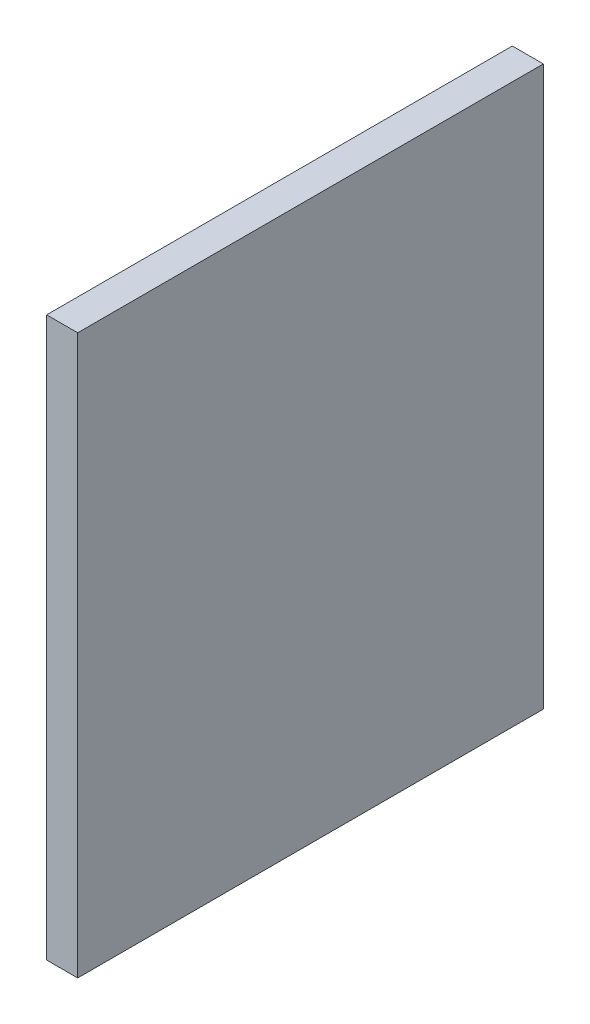
ISO-10303-21;
HEADER;
FILE_DESCRIPTION(('STEP AP214'),'2;1');
FILE_NAME('part.step','',(''),(''),'','','');
FILE_SCHEMA(('AUTOMOTIVE_DESIGN { 1 0 10303 214 1 1 1 1 }'));
ENDSEC;
DATA;
#1=APPLICATION_CONTEXT('core data for automotive mechanical design processes');
#2=APPLICATION_PROTOCOL_DEFINITION('international standard','automotive_design',2000,#1);
#3=PRODUCT_CONTEXT('',#1,'mechanical');
#4=PRODUCT('Part','Part','',(#3));
#5=PRODUCT_RELATED_PRODUCT_CATEGORY('part','',(#4));
#6=PRODUCT_DEFINITION_FORMATION('','',#4);
#7=PRODUCT_DEFINITION_CONTEXT('part definition',#1,'design');
#8=PRODUCT_DEFINITION('design','',#6,#7);
#9=PRODUCT_DEFINITION_SHAPE('','',#8);
#10=(LENGTH_UNIT() NAMED_UNIT(*) SI_UNIT(.MILLI.,.METRE.));
#11=(NAMED_UNIT(*) PLANE_ANGLE_UNIT() SI_UNIT($,.RADIAN.));
#12=(NAMED_UNIT(*) SI_UNIT($,.STERADIAN.) SOLID_ANGLE_UNIT());
#13=UNCERTAINTY_MEASURE_WITH_UNIT(LENGTH_MEASURE(1.E-05),#10,'distance_accuracy_value','');
#14=(GEOMETRIC_REPRESENTATION_CONTEXT(3) GLOBAL_UNCERTAINTY_ASSIGNED_CONTEXT((#13)) GLOBAL_UNIT_ASSIGNED_CONTEXT((#10,
#11,#12)) REPRESENTATION_CONTEXT('',''));
#15=CARTESIAN_POINT('',(0.,0.,0.));
#16=DIRECTION('',(0.,0.,1.));
#17=DIRECTION('',(1.,0.,0.));
#18=AXIS2_PLACEMENT_3D('',#15,#16,#17);
#19=CARTESIAN_POINT('',(2.,-18.,15.));
#20=DIRECTION('',(0.,0.,-1.));
#21=DIRECTION('',(-1.,0.,0.));
#22=AXIS2_PLACEMENT_3D('',#19,#20,#21);
#23=PLANE('',#22);
#24=DIRECTION('',(0.,-1.,0.));
#25=VECTOR('',#24,1.);
#26=CARTESIAN_POINT('',(0.,-18.,15.));
#27=LINE('',#26,#25);
#28=CARTESIAN_POINT('',(0.,18.,15.));
#29=VERTEX_POINT('',#28);
#30=CARTESIAN_POINT('',(0.,-18.,15.));
#31=VERTEX_POINT('',#30);
#32=EDGE_CURVE('E95',#29,#31,#27,.T.);
#33=ORIENTED_EDGE('',*,*,#32,.T.);
#34=DIRECTION('',(-1.,0.,0.));
#35=VECTOR('',#34,1.);
#36=CARTESIAN_POINT('',(2.,-18.,15.));
#37=LINE('',#36,#35);
#38=CARTESIAN_POINT('',(2.,-18.,15.));
#39=VERTEX_POINT('',#38);
#40=EDGE_CURVE('E11',#39,#31,#37,.T.);
#41=ORIENTED_EDGE('',*,*,#40,.F.);
#42=DIRECTION('',(0.,-1.,0.));
#43=VECTOR('',#42,1.);
#44=CARTESIAN_POINT('',(2.,-18.,15.));
#45=LINE('',#44,#43);
#46=CARTESIAN_POINT('',(2.,18.,15.));
#47=VERTEX_POINT('',#46);
#48=EDGE_CURVE('E83',#47,#39,#45,.T.);
#49=ORIENTED_EDGE('',*,*,#48,.F.);
#50=DIRECTION('',(-1.,0.,0.));
#51=VECTOR('',#50,1.);
#52=CARTESIAN_POINT('',(2.,18.,15.));
#53=LINE('',#52,#51);
#54=EDGE_CURVE('E91',#47,#29,#53,.T.);
#55=ORIENTED_EDGE('',*,*,#54,.T.);
#56=EDGE_LOOP('',(#33,#41,#49,#55));
#57=FACE_BOUND('',#56,.T.);
#58=ADVANCED_FACE('F32',(#57),#23,.F.);
#59=CARTESIAN_POINT('',(2.,-18.,-15.));
#60=DIRECTION('',(0.,1.,0.));
#61=DIRECTION('',(0.,0.,1.));
#62=AXIS2_PLACEMENT_3D('',#59,#60,#61);
#63=PLANE('',#62);
#64=DIRECTION('',(0.,0.,-1.));
#65=VECTOR('',#64,1.);
#66=CARTESIAN_POINT('',(0.,-18.,-15.));
#67=LINE('',#66,#65);
#68=CARTESIAN_POINT('',(0.,-18.,-15.));
#69=VERTEX_POINT('',#68);
#70=EDGE_CURVE('E87',#31,#69,#67,.T.);
#71=ORIENTED_EDGE('',*,*,#70,.T.);
#72=DIRECTION('',(-1.,0.,0.));
#73=VECTOR('',#72,1.);
#74=CARTESIAN_POINT('',(2.,-18.,-15.));
#75=LINE('',#74,#73);
#76=CARTESIAN_POINT('',(2.,-18.,-15.));
#77=VERTEX_POINT('',#76);
#78=EDGE_CURVE('E40',#77,#69,#75,.T.);
#79=ORIENTED_EDGE('',*,*,#78,.F.);
#80=DIRECTION('',(0.,0.,-1.));
#81=VECTOR('',#80,1.);
#82=CARTESIAN_POINT('',(2.,-18.,-15.));
#83=LINE('',#82,#81);
#84=EDGE_CURVE('E78',#39,#77,#83,.T.);
#85=ORIENTED_EDGE('',*,*,#84,.F.);
#86=ORIENTED_EDGE('',*,*,#40,.T.);
#87=EDGE_LOOP('',(#71,#79,#85,#86));
#88=FACE_BOUND('',#87,.T.);
#89=ADVANCED_FACE('F86',(#88),#63,.F.);
#90=CARTESIAN_POINT('',(2.,-18.,-15.));
#91=DIRECTION('',(0.,0.,1.));
#92=DIRECTION('',(1.,0.,0.));
#93=AXIS2_PLACEMENT_3D('',#90,#91,#92);
#94=PLANE('',#93);
#95=DIRECTION('',(0.,1.,0.));
#96=VECTOR('',#95,1.);
#97=CARTESIAN_POINT('',(0.,-18.,-15.));
#98=LINE('',#97,#96);
#99=CARTESIAN_POINT('',(0.,18.,-15.));
#100=VERTEX_POINT('',#99);
#101=EDGE_CURVE('E65',#69,#100,#98,.T.);
#102=ORIENTED_EDGE('',*,*,#101,.T.);
#103=DIRECTION('',(-1.,0.,0.));
#104=VECTOR('',#103,1.);
#105=CARTESIAN_POINT('',(2.,18.,-15.));
#106=LINE('',#105,#104);
#107=CARTESIAN_POINT('',(2.,18.,-15.));
#108=VERTEX_POINT('',#107);
#109=EDGE_CURVE('E88',#108,#100,#106,.T.);
#110=ORIENTED_EDGE('',*,*,#109,.F.);
#111=DIRECTION('',(0.,1.,0.));
#112=VECTOR('',#111,1.);
#113=CARTESIAN_POINT('',(2.,-18.,-15.));
#114=LINE('',#113,#112);
#115=EDGE_CURVE('E81',#77,#108,#114,.T.);
#116=ORIENTED_EDGE('',*,*,#115,.F.);
#117=ORIENTED_EDGE('',*,*,#78,.T.);
#118=EDGE_LOOP('',(#102,#110,#116,#117));
#119=FACE_BOUND('',#118,.T.);
#120=ADVANCED_FACE('F89',(#119),#94,.F.);
#121=CARTESIAN_POINT('',(2.,18.,-15.));
#122=DIRECTION('',(0.,-1.,0.));
#123=DIRECTION('',(0.,0.,-1.));
#124=AXIS2_PLACEMENT_3D('',#121,#122,#123);
#125=PLANE('',#124);
#126=DIRECTION('',(0.,0.,1.));
#127=VECTOR('',#126,1.);
#128=CARTESIAN_POINT('',(0.,18.,-15.));
#129=LINE('',#128,#127);
#130=EDGE_CURVE('E71',#100,#29,#129,.T.);
#131=ORIENTED_EDGE('',*,*,#130,.T.);
#132=ORIENTED_EDGE('',*,*,#54,.F.);
#133=DIRECTION('',(0.,0.,1.));
#134=VECTOR('',#133,1.);
#135=CARTESIAN_POINT('',(2.,18.,-15.));
#136=LINE('',#135,#134);
#137=EDGE_CURVE('E48',#108,#47,#136,.T.);
#138=ORIENTED_EDGE('',*,*,#137,.F.);
#139=ORIENTED_EDGE('',*,*,#109,.T.);
#140=EDGE_LOOP('',(#131,#132,#138,#139));
#141=FACE_BOUND('',#140,.T.);
#142=ADVANCED_FACE('F102',(#141),#125,.F.);
#143=CARTESIAN_POINT('',(2.,0.,0.));
#144=DIRECTION('',(1.,0.,0.));
#145=DIRECTION('',(0.,0.,-1.));
#146=AXIS2_PLACEMENT_3D('',#143,#144,#145);
#147=PLANE('',#146);
#148=ORIENTED_EDGE('',*,*,#48,.T.);
#149=ORIENTED_EDGE('',*,*,#84,.T.);
#150=ORIENTED_EDGE('',*,*,#115,.T.);
#151=ORIENTED_EDGE('',*,*,#137,.T.);
#152=EDGE_LOOP('',(#148,#149,#150,#151));
#153=FACE_BOUND('',#152,.T.);
#154=ADVANCED_FACE('F79',(#153),#147,.T.);
#155=CARTESIAN_POINT('',(0.,0.,0.));
#156=DIRECTION('',(1.,0.,0.));
#157=DIRECTION('',(0.,0.,-1.));
#158=AXIS2_PLACEMENT_3D('',#155,#156,#157);
#159=PLANE('',#158);
#160=ORIENTED_EDGE('',*,*,#32,.F.);
#161=ORIENTED_EDGE('',*,*,#130,.F.);
#162=ORIENTED_EDGE('',*,*,#101,.F.);
#163=ORIENTED_EDGE('',*,*,#70,.F.);
#164=EDGE_LOOP('',(#160,#161,#162,#163));
#165=FACE_BOUND('',#164,.T.);
#166=ADVANCED_FACE('F105',(#165),#159,.F.);
#167=CLOSED_SHELL('',(#58,#89,#120,#142,#154,#166));
#168=MANIFOLD_SOLID_BREP('B2',#167);
#169=ADVANCED_BREP_SHAPE_REPRESENTATION('',(#18,#168),#14);
#170=SHAPE_DEFINITION_REPRESENTATION(#9,#169);
ENDSEC;
END-ISO-10303-21;
